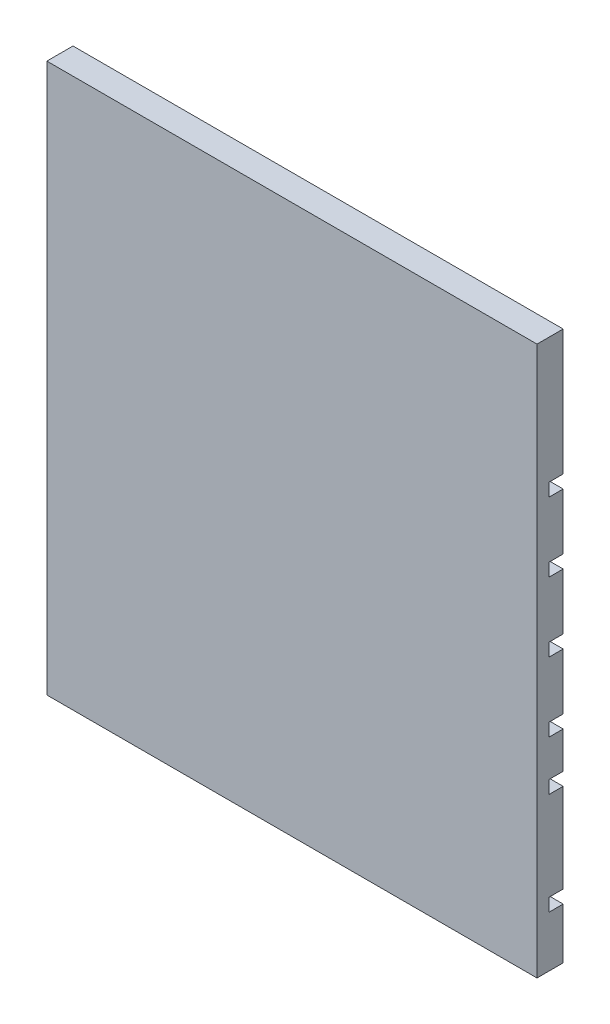
ISO-10303-21;
HEADER;
FILE_DESCRIPTION(('STEP AP214'),'2;1');
FILE_NAME('part.step','',(''),(''),'','','');
FILE_SCHEMA(('AUTOMOTIVE_DESIGN { 1 0 10303 214 1 1 1 1 }'));
ENDSEC;
DATA;
#1=APPLICATION_CONTEXT('core data for automotive mechanical design processes');
#2=APPLICATION_PROTOCOL_DEFINITION('international standard','automotive_design',2000,#1);
#3=PRODUCT_CONTEXT('',#1,'mechanical');
#4=PRODUCT('Part','Part','',(#3));
#5=PRODUCT_RELATED_PRODUCT_CATEGORY('part','',(#4));
#6=PRODUCT_DEFINITION_FORMATION('','',#4);
#7=PRODUCT_DEFINITION_CONTEXT('part definition',#1,'design');
#8=PRODUCT_DEFINITION('design','',#6,#7);
#9=PRODUCT_DEFINITION_SHAPE('','',#8);
#10=(LENGTH_UNIT() NAMED_UNIT(*) SI_UNIT(.MILLI.,.METRE.));
#11=(NAMED_UNIT(*) PLANE_ANGLE_UNIT() SI_UNIT($,.RADIAN.));
#12=(NAMED_UNIT(*) SI_UNIT($,.STERADIAN.) SOLID_ANGLE_UNIT());
#13=UNCERTAINTY_MEASURE_WITH_UNIT(LENGTH_MEASURE(1.E-05),#10,'distance_accuracy_value','');
#14=(GEOMETRIC_REPRESENTATION_CONTEXT(3) GLOBAL_UNCERTAINTY_ASSIGNED_CONTEXT((#13)) GLOBAL_UNIT_ASSIGNED_CONTEXT((#10,
#11,#12)) REPRESENTATION_CONTEXT('',''));
#15=CARTESIAN_POINT('',(0.,0.,0.));
#16=DIRECTION('',(0.,0.,1.));
#17=DIRECTION('',(1.,0.,0.));
#18=AXIS2_PLACEMENT_3D('',#15,#16,#17);
#19=CARTESIAN_POINT('',(-75.,-8.,2.));
#20=DIRECTION('',(1.,0.,0.));
#21=DIRECTION('',(0.,0.,-1.));
#22=AXIS2_PLACEMENT_3D('',#19,#20,#21);
#23=PLANE('',#22);
#24=DIRECTION('',(0.,0.,-1.));
#25=VECTOR('',#24,1.);
#26=CARTESIAN_POINT('',(-75.,24.987500000001,2.));
#27=LINE('',#26,#25);
#28=CARTESIAN_POINT('',(-75.,24.987500000001,0.199999999999214));
#29=VERTEX_POINT('',#28);
#30=CARTESIAN_POINT('',(-75.,24.987500000001,-2.));
#31=VERTEX_POINT('',#30);
#32=EDGE_CURVE('E237',#29,#31,#27,.T.);
#33=ORIENTED_EDGE('',*,*,#32,.F.);
#34=DIRECTION('',(0.,1.,0.));
#35=VECTOR('',#34,1.);
#36=CARTESIAN_POINT('',(-75.,-8.,0.199999999999214));
#37=LINE('',#36,#35);
#38=CARTESIAN_POINT('',(-75.,23.000000000001,0.199999999999214));
#39=VERTEX_POINT('',#38);
#40=EDGE_CURVE('E230',#39,#29,#37,.T.);
#41=ORIENTED_EDGE('',*,*,#40,.F.);
#42=DIRECTION('',(0.,0.,-1.));
#43=VECTOR('',#42,1.);
#44=CARTESIAN_POINT('',(-75.,23.000000000001,2.));
#45=LINE('',#44,#43);
#46=CARTESIAN_POINT('',(-75.,23.000000000001,-2.));
#47=VERTEX_POINT('',#46);
#48=EDGE_CURVE('E217',#39,#47,#45,.T.);
#49=ORIENTED_EDGE('',*,*,#48,.T.);
#50=DIRECTION('',(0.,-1.,0.));
#51=VECTOR('',#50,1.);
#52=CARTESIAN_POINT('',(-75.,-8.,-2.));
#53=LINE('',#52,#51);
#54=CARTESIAN_POINT('',(-75.,17.387500000001,-2.));
#55=VERTEX_POINT('',#54);
#56=EDGE_CURVE('E348',#47,#55,#53,.T.);
#57=ORIENTED_EDGE('',*,*,#56,.T.);
#58=DIRECTION('',(0.,0.,1.));
#59=VECTOR('',#58,1.);
#60=CARTESIAN_POINT('',(-75.,17.387500000001,2.));
#61=LINE('',#60,#59);
#62=CARTESIAN_POINT('',(-75.,17.387500000001,0.199999999999214));
#63=VERTEX_POINT('',#62);
#64=EDGE_CURVE('E308',#55,#63,#61,.T.);
#65=ORIENTED_EDGE('',*,*,#64,.T.);
#66=DIRECTION('',(0.,1.,0.));
#67=VECTOR('',#66,1.);
#68=CARTESIAN_POINT('',(-75.,-8.,0.199999999999214));
#69=LINE('',#68,#67);
#70=CARTESIAN_POINT('',(-75.,15.400000000001,0.199999999999214));
#71=VERTEX_POINT('',#70);
#72=EDGE_CURVE('E311',#71,#63,#69,.T.);
#73=ORIENTED_EDGE('',*,*,#72,.F.);
#74=DIRECTION('',(0.,0.,1.));
#75=VECTOR('',#74,1.);
#76=CARTESIAN_POINT('',(-75.,15.400000000001,2.));
#77=LINE('',#76,#75);
#78=CARTESIAN_POINT('',(-75.,15.400000000001,-2.));
#79=VERTEX_POINT('',#78);
#80=EDGE_CURVE('E303',#79,#71,#77,.T.);
#81=ORIENTED_EDGE('',*,*,#80,.F.);
#82=CARTESIAN_POINT('',(-75.,1.78750000000105,-2.));
#83=VERTEX_POINT('',#82);
#84=EDGE_CURVE('E413',#79,#83,#53,.T.);
#85=ORIENTED_EDGE('',*,*,#84,.T.);
#86=DIRECTION('',(0.,0.,-1.));
#87=VECTOR('',#86,1.);
#88=CARTESIAN_POINT('',(-75.,1.78750000000105,2.));
#89=LINE('',#88,#87);
#90=CARTESIAN_POINT('',(-75.,1.78750000000105,0.199999999999221));
#91=VERTEX_POINT('',#90);
#92=EDGE_CURVE('E290',#91,#83,#89,.T.);
#93=ORIENTED_EDGE('',*,*,#92,.F.);
#94=DIRECTION('',(0.,1.,0.));
#95=VECTOR('',#94,1.);
#96=CARTESIAN_POINT('',(-75.,-8.,0.199999999999221));
#97=LINE('',#96,#95);
#98=CARTESIAN_POINT('',(-75.,-0.199999999998953,0.199999999999221));
#99=VERTEX_POINT('',#98);
#100=EDGE_CURVE('E292',#99,#91,#97,.T.);
#101=ORIENTED_EDGE('',*,*,#100,.F.);
#102=DIRECTION('',(0.,0.,-1.));
#103=VECTOR('',#102,1.);
#104=CARTESIAN_POINT('',(-75.,-0.199999999998953,2.));
#105=LINE('',#104,#103);
#106=CARTESIAN_POINT('',(-75.,-0.199999999998953,-2.));
#107=VERTEX_POINT('',#106);
#108=EDGE_CURVE('E284',#99,#107,#105,.T.);
#109=ORIENTED_EDGE('',*,*,#108,.T.);
#110=CARTESIAN_POINT('',(-75.,-8.,-2.));
#111=VERTEX_POINT('',#110);
#112=EDGE_CURVE('E331',#107,#111,#53,.T.);
#113=ORIENTED_EDGE('',*,*,#112,.T.);
#114=DIRECTION('',(0.,0.,-1.));
#115=VECTOR('',#114,1.);
#116=CARTESIAN_POINT('',(-75.,-8.,2.));
#117=LINE('',#116,#115);
#118=CARTESIAN_POINT('',(-75.,-8.,2.));
#119=VERTEX_POINT('',#118);
#120=EDGE_CURVE('E364',#119,#111,#117,.T.);
#121=ORIENTED_EDGE('',*,*,#120,.F.);
#122=DIRECTION('',(0.,-1.,0.));
#123=VECTOR('',#122,1.);
#124=CARTESIAN_POINT('',(-75.,-8.,2.));
#125=LINE('',#124,#123);
#126=CARTESIAN_POINT('',(-75.,76.,2.));
#127=VERTEX_POINT('',#126);
#128=EDGE_CURVE('E332',#127,#119,#125,.T.);
#129=ORIENTED_EDGE('',*,*,#128,.F.);
#130=DIRECTION('',(0.,0.,-1.));
#131=VECTOR('',#130,1.);
#132=CARTESIAN_POINT('',(-75.,76.,2.));
#133=LINE('',#132,#131);
#134=CARTESIAN_POINT('',(-75.,76.,-2.));
#135=VERTEX_POINT('',#134);
#136=EDGE_CURVE('E342',#127,#135,#133,.T.);
#137=ORIENTED_EDGE('',*,*,#136,.T.);
#138=CARTESIAN_POINT('',(-75.,56.787500000001,-2.));
#139=VERTEX_POINT('',#138);
#140=EDGE_CURVE('E343',#135,#139,#53,.T.);
#141=ORIENTED_EDGE('',*,*,#140,.T.);
#142=DIRECTION('',(0.,0.,-1.));
#143=VECTOR('',#142,1.);
#144=CARTESIAN_POINT('',(-75.,56.7875000000011,2.));
#145=LINE('',#144,#143);
#146=CARTESIAN_POINT('',(-75.,56.787500000001,0.199999999999214));
#147=VERTEX_POINT('',#146);
#148=EDGE_CURVE('E327',#147,#139,#145,.T.);
#149=ORIENTED_EDGE('',*,*,#148,.F.);
#150=DIRECTION('',(0.,1.,0.));
#151=VECTOR('',#150,1.);
#152=CARTESIAN_POINT('',(-75.,-8.,0.199999999999214));
#153=LINE('',#152,#151);
#154=CARTESIAN_POINT('',(-75.,54.800000000001,0.199999999999214));
#155=VERTEX_POINT('',#154);
#156=EDGE_CURVE('E329',#155,#147,#153,.T.);
#157=ORIENTED_EDGE('',*,*,#156,.F.);
#158=DIRECTION('',(0.,0.,-1.));
#159=VECTOR('',#158,1.);
#160=CARTESIAN_POINT('',(-75.,54.800000000001,2.));
#161=LINE('',#160,#159);
#162=CARTESIAN_POINT('',(-75.,54.800000000001,-2.));
#163=VERTEX_POINT('',#162);
#164=EDGE_CURVE('E322',#155,#163,#161,.T.);
#165=ORIENTED_EDGE('',*,*,#164,.T.);
#166=CARTESIAN_POINT('',(-75.,46.187500000001,-2.));
#167=VERTEX_POINT('',#166);
#168=EDGE_CURVE('E347',#163,#167,#53,.T.);
#169=ORIENTED_EDGE('',*,*,#168,.T.);
#170=DIRECTION('',(0.,0.,-1.));
#171=VECTOR('',#170,1.);
#172=CARTESIAN_POINT('',(-75.,46.187500000001,2.));
#173=LINE('',#172,#171);
#174=CARTESIAN_POINT('',(-75.,46.187500000001,0.199999999999214));
#175=VERTEX_POINT('',#174);
#176=EDGE_CURVE('E273',#175,#167,#173,.T.);
#177=ORIENTED_EDGE('',*,*,#176,.F.);
#178=DIRECTION('',(0.,1.,0.));
#179=VECTOR('',#178,1.);
#180=CARTESIAN_POINT('',(-75.,-8.,0.199999999999214));
#181=LINE('',#180,#179);
#182=CARTESIAN_POINT('',(-75.,44.2000000000011,0.199999999999214));
#183=VERTEX_POINT('',#182);
#184=EDGE_CURVE('E275',#183,#175,#181,.T.);
#185=ORIENTED_EDGE('',*,*,#184,.F.);
#186=DIRECTION('',(0.,0.,-1.));
#187=VECTOR('',#186,1.);
#188=CARTESIAN_POINT('',(-75.,44.2000000000011,2.));
#189=LINE('',#188,#187);
#190=CARTESIAN_POINT('',(-75.,44.2000000000011,-2.));
#191=VERTEX_POINT('',#190);
#192=EDGE_CURVE('E268',#183,#191,#189,.T.);
#193=ORIENTED_EDGE('',*,*,#192,.T.);
#194=CARTESIAN_POINT('',(-75.,35.587500000001,-2.));
#195=VERTEX_POINT('',#194);
#196=EDGE_CURVE('E411',#191,#195,#53,.T.);
#197=ORIENTED_EDGE('',*,*,#196,.T.);
#198=DIRECTION('',(0.,0.,-1.));
#199=VECTOR('',#198,1.);
#200=CARTESIAN_POINT('',(-75.,35.587500000001,2.));
#201=LINE('',#200,#199);
#202=CARTESIAN_POINT('',(-75.,35.587500000001,0.199999999999214));
#203=VERTEX_POINT('',#202);
#204=EDGE_CURVE('E255',#203,#195,#201,.T.);
#205=ORIENTED_EDGE('',*,*,#204,.F.);
#206=DIRECTION('',(0.,1.,0.));
#207=VECTOR('',#206,1.);
#208=CARTESIAN_POINT('',(-75.,-8.,0.199999999999214));
#209=LINE('',#208,#207);
#210=CARTESIAN_POINT('',(-75.,33.600000000001,0.199999999999214));
#211=VERTEX_POINT('',#210);
#212=EDGE_CURVE('E257',#211,#203,#209,.T.);
#213=ORIENTED_EDGE('',*,*,#212,.F.);
#214=DIRECTION('',(0.,0.,-1.));
#215=VECTOR('',#214,1.);
#216=CARTESIAN_POINT('',(-75.,33.600000000001,2.));
#217=LINE('',#216,#215);
#218=CARTESIAN_POINT('',(-75.,33.600000000001,-2.));
#219=VERTEX_POINT('',#218);
#220=EDGE_CURVE('E250',#211,#219,#217,.T.);
#221=ORIENTED_EDGE('',*,*,#220,.T.);
#222=EDGE_CURVE('E408',#219,#31,#53,.T.);
#223=ORIENTED_EDGE('',*,*,#222,.T.);
#224=EDGE_LOOP('',(#33,#41,#49,#57,#65,#73,#81,#85,#93,#101,#109,#113,#121,#129,#137,#141,#149,
#157,#165,#169,#177,#185,#193,#197,#205,#213,#221,#223));
#225=FACE_BOUND('',#224,.T.);
#226=ADVANCED_FACE('F33',(#225),#23,.F.);
#227=CARTESIAN_POINT('',(0.,-8.,2.));
#228=DIRECTION('',(-1.,0.,0.));
#229=DIRECTION('',(0.,0.,1.));
#230=AXIS2_PLACEMENT_3D('',#227,#228,#229);
#231=PLANE('',#230);
#232=DIRECTION('',(0.,0.,1.));
#233=VECTOR('',#232,1.);
#234=CARTESIAN_POINT('',(0.,24.9875,2.));
#235=LINE('',#234,#233);
#236=CARTESIAN_POINT('',(0.,24.9875,-2.));
#237=VERTEX_POINT('',#236);
#238=CARTESIAN_POINT('',(0.,24.9875,0.2));
#239=VERTEX_POINT('',#238);
#240=EDGE_CURVE('E225',#237,#239,#235,.T.);
#241=ORIENTED_EDGE('',*,*,#240,.F.);
#242=DIRECTION('',(0.,1.,0.));
#243=VECTOR('',#242,1.);
#244=CARTESIAN_POINT('',(0.,-8.,-2.));
#245=LINE('',#244,#243);
#246=CARTESIAN_POINT('',(0.,33.6000000000005,-2.));
#247=VERTEX_POINT('',#246);
#248=EDGE_CURVE('E55',#237,#247,#245,.T.);
#249=ORIENTED_EDGE('',*,*,#248,.T.);
#250=DIRECTION('',(0.,0.,1.));
#251=VECTOR('',#250,1.);
#252=CARTESIAN_POINT('',(0.,33.6,2.));
#253=LINE('',#252,#251);
#254=CARTESIAN_POINT('',(0.,33.6,0.2));
#255=VERTEX_POINT('',#254);
#256=EDGE_CURVE('E247',#247,#255,#253,.T.);
#257=ORIENTED_EDGE('',*,*,#256,.T.);
#258=DIRECTION('',(0.,-1.,0.));
#259=VECTOR('',#258,1.);
#260=CARTESIAN_POINT('',(0.,-8.,0.2));
#261=LINE('',#260,#259);
#262=CARTESIAN_POINT('',(0.,35.5875,0.2));
#263=VERTEX_POINT('',#262);
#264=EDGE_CURVE('E401',#263,#255,#261,.T.);
#265=ORIENTED_EDGE('',*,*,#264,.F.);
#266=DIRECTION('',(0.,0.,1.));
#267=VECTOR('',#266,1.);
#268=CARTESIAN_POINT('',(0.,35.5875,2.));
#269=LINE('',#268,#267);
#270=CARTESIAN_POINT('',(0.,35.5875,-2.));
#271=VERTEX_POINT('',#270);
#272=EDGE_CURVE('E253',#271,#263,#269,.T.);
#273=ORIENTED_EDGE('',*,*,#272,.F.);
#274=CARTESIAN_POINT('',(0.,44.2000000000005,-2.));
#275=VERTEX_POINT('',#274);
#276=EDGE_CURVE('E448',#271,#275,#245,.T.);
#277=ORIENTED_EDGE('',*,*,#276,.T.);
#278=DIRECTION('',(0.,0.,1.));
#279=VECTOR('',#278,1.);
#280=CARTESIAN_POINT('',(0.,44.2,2.));
#281=LINE('',#280,#279);
#282=CARTESIAN_POINT('',(0.,44.2,0.2));
#283=VERTEX_POINT('',#282);
#284=EDGE_CURVE('E263',#275,#283,#281,.T.);
#285=ORIENTED_EDGE('',*,*,#284,.T.);
#286=DIRECTION('',(0.,-1.,0.));
#287=VECTOR('',#286,1.);
#288=CARTESIAN_POINT('',(0.,-8.,0.2));
#289=LINE('',#288,#287);
#290=CARTESIAN_POINT('',(0.,46.1875,0.2));
#291=VERTEX_POINT('',#290);
#292=EDGE_CURVE('E394',#291,#283,#289,.T.);
#293=ORIENTED_EDGE('',*,*,#292,.F.);
#294=DIRECTION('',(0.,0.,1.));
#295=VECTOR('',#294,1.);
#296=CARTESIAN_POINT('',(0.,46.1875,2.));
#297=LINE('',#296,#295);
#298=CARTESIAN_POINT('',(0.,46.1875,-2.));
#299=VERTEX_POINT('',#298);
#300=EDGE_CURVE('E271',#299,#291,#297,.T.);
#301=ORIENTED_EDGE('',*,*,#300,.F.);
#302=CARTESIAN_POINT('',(0.,54.8000000000005,-2.));
#303=VERTEX_POINT('',#302);
#304=EDGE_CURVE('E428',#299,#303,#245,.T.);
#305=ORIENTED_EDGE('',*,*,#304,.T.);
#306=DIRECTION('',(0.,0.,1.));
#307=VECTOR('',#306,1.);
#308=CARTESIAN_POINT('',(0.,54.8,2.));
#309=LINE('',#308,#307);
#310=CARTESIAN_POINT('',(0.,54.8,0.2));
#311=VERTEX_POINT('',#310);
#312=EDGE_CURVE('E317',#303,#311,#309,.T.);
#313=ORIENTED_EDGE('',*,*,#312,.T.);
#314=DIRECTION('',(0.,-1.,0.));
#315=VECTOR('',#314,1.);
#316=CARTESIAN_POINT('',(0.,-8.,0.2));
#317=LINE('',#316,#315);
#318=CARTESIAN_POINT('',(0.,56.7875,0.2));
#319=VERTEX_POINT('',#318);
#320=EDGE_CURVE('E372',#319,#311,#317,.T.);
#321=ORIENTED_EDGE('',*,*,#320,.F.);
#322=DIRECTION('',(0.,0.,1.));
#323=VECTOR('',#322,1.);
#324=CARTESIAN_POINT('',(0.,56.7875,2.));
#325=LINE('',#324,#323);
#326=CARTESIAN_POINT('',(0.,56.7875,-2.));
#327=VERTEX_POINT('',#326);
#328=EDGE_CURVE('E325',#327,#319,#325,.T.);
#329=ORIENTED_EDGE('',*,*,#328,.F.);
#330=CARTESIAN_POINT('',(0.,76.,-2.));
#331=VERTEX_POINT('',#330);
#332=EDGE_CURVE('E350',#327,#331,#245,.T.);
#333=ORIENTED_EDGE('',*,*,#332,.T.);
#334=DIRECTION('',(0.,0.,-1.));
#335=VECTOR('',#334,1.);
#336=CARTESIAN_POINT('',(0.,76.,2.));
#337=LINE('',#336,#335);
#338=CARTESIAN_POINT('',(0.,76.,2.));
#339=VERTEX_POINT('',#338);
#340=EDGE_CURVE('E358',#339,#331,#337,.T.);
#341=ORIENTED_EDGE('',*,*,#340,.F.);
#342=DIRECTION('',(0.,1.,0.));
#343=VECTOR('',#342,1.);
#344=CARTESIAN_POINT('',(0.,-8.,2.));
#345=LINE('',#344,#343);
#346=CARTESIAN_POINT('',(0.,-8.,2.));
#347=VERTEX_POINT('',#346);
#348=EDGE_CURVE('E338',#347,#339,#345,.T.);
#349=ORIENTED_EDGE('',*,*,#348,.F.);
#350=DIRECTION('',(0.,0.,-1.));
#351=VECTOR('',#350,1.);
#352=CARTESIAN_POINT('',(0.,-8.,2.));
#353=LINE('',#352,#351);
#354=CARTESIAN_POINT('',(0.,-8.,-2.));
#355=VERTEX_POINT('',#354);
#356=EDGE_CURVE('E361',#347,#355,#353,.T.);
#357=ORIENTED_EDGE('',*,*,#356,.T.);
#358=CARTESIAN_POINT('',(0.,-0.2,-2.));
#359=VERTEX_POINT('',#358);
#360=EDGE_CURVE('E351',#355,#359,#245,.T.);
#361=ORIENTED_EDGE('',*,*,#360,.T.);
#362=DIRECTION('',(0.,0.,1.));
#363=VECTOR('',#362,1.);
#364=CARTESIAN_POINT('',(0.,-0.2,2.));
#365=LINE('',#364,#363);
#366=CARTESIAN_POINT('',(0.,-0.2,0.200000000000002));
#367=VERTEX_POINT('',#366);
#368=EDGE_CURVE('E381',#359,#367,#365,.T.);
#369=ORIENTED_EDGE('',*,*,#368,.T.);
#370=DIRECTION('',(0.,-1.,0.));
#371=VECTOR('',#370,1.);
#372=CARTESIAN_POINT('',(0.,-8.,0.2));
#373=LINE('',#372,#371);
#374=CARTESIAN_POINT('',(0.,1.7875,0.2));
#375=VERTEX_POINT('',#374);
#376=EDGE_CURVE('E384',#375,#367,#373,.T.);
#377=ORIENTED_EDGE('',*,*,#376,.F.);
#378=DIRECTION('',(0.,0.,1.));
#379=VECTOR('',#378,1.);
#380=CARTESIAN_POINT('',(0.,1.7875,2.));
#381=LINE('',#380,#379);
#382=CARTESIAN_POINT('',(0.,1.7875,-2.));
#383=VERTEX_POINT('',#382);
#384=EDGE_CURVE('E387',#383,#375,#381,.T.);
#385=ORIENTED_EDGE('',*,*,#384,.F.);
#386=CARTESIAN_POINT('',(0.,15.4000000000005,-2.));
#387=VERTEX_POINT('',#386);
#388=EDGE_CURVE('E354',#383,#387,#245,.T.);
#389=ORIENTED_EDGE('',*,*,#388,.T.);
#390=DIRECTION('',(0.,0.,-1.));
#391=VECTOR('',#390,1.);
#392=CARTESIAN_POINT('',(0.,15.4,2.));
#393=LINE('',#392,#391);
#394=CARTESIAN_POINT('',(0.,15.4,0.2));
#395=VERTEX_POINT('',#394);
#396=EDGE_CURVE('E300',#395,#387,#393,.T.);
#397=ORIENTED_EDGE('',*,*,#396,.F.);
#398=DIRECTION('',(0.,-1.,0.));
#399=VECTOR('',#398,1.);
#400=CARTESIAN_POINT('',(0.,-8.,0.2));
#401=LINE('',#400,#399);
#402=CARTESIAN_POINT('',(0.,17.3875,0.2));
#403=VERTEX_POINT('',#402);
#404=EDGE_CURVE('E379',#403,#395,#401,.T.);
#405=ORIENTED_EDGE('',*,*,#404,.F.);
#406=DIRECTION('',(0.,0.,-1.));
#407=VECTOR('',#406,1.);
#408=CARTESIAN_POINT('',(0.,17.3875,2.));
#409=LINE('',#408,#407);
#410=CARTESIAN_POINT('',(0.,17.3875,-2.));
#411=VERTEX_POINT('',#410);
#412=EDGE_CURVE('E305',#403,#411,#409,.T.);
#413=ORIENTED_EDGE('',*,*,#412,.T.);
#414=CARTESIAN_POINT('',(0.,23.0000000000005,-2.));
#415=VERTEX_POINT('',#414);
#416=EDGE_CURVE('E518',#411,#415,#245,.T.);
#417=ORIENTED_EDGE('',*,*,#416,.T.);
#418=DIRECTION('',(0.,0.,1.));
#419=VECTOR('',#418,1.);
#420=CARTESIAN_POINT('',(0.,23.,2.));
#421=LINE('',#420,#419);
#422=CARTESIAN_POINT('',(0.,23.,0.2));
#423=VERTEX_POINT('',#422);
#424=EDGE_CURVE('E47',#415,#423,#421,.T.);
#425=ORIENTED_EDGE('',*,*,#424,.T.);
#426=DIRECTION('',(0.,-1.,0.));
#427=VECTOR('',#426,1.);
#428=CARTESIAN_POINT('',(0.,-8.,0.2));
#429=LINE('',#428,#427);
#430=EDGE_CURVE('E11',#239,#423,#429,.T.);
#431=ORIENTED_EDGE('',*,*,#430,.F.);
#432=EDGE_LOOP('',(#241,#249,#257,#265,#273,#277,#285,#293,#301,#305,#313,#321,#329,#333,#341,
#349,#357,#361,#369,#377,#385,#389,#397,#405,#413,#417,#425,#431));
#433=FACE_BOUND('',#432,.T.);
#434=ADVANCED_FACE('F434',(#433),#231,.F.);
#435=CARTESIAN_POINT('',(0.,0.,-2.));
#436=DIRECTION('',(0.,0.,-1.));
#437=DIRECTION('',(-1.,0.,0.));
#438=AXIS2_PLACEMENT_3D('',#435,#436,#437);
#439=PLANE('',#438);
#440=ORIENTED_EDGE('',*,*,#248,.F.);
#441=DIRECTION('',(-1.,0.,0.));
#442=VECTOR('',#441,1.);
#443=CARTESIAN_POINT('',(3.48973761942883E-13,24.9875,-2.));
#444=LINE('',#443,#442);
#445=EDGE_CURVE('E40',#237,#31,#444,.T.);
#446=ORIENTED_EDGE('',*,*,#445,.T.);
#447=ORIENTED_EDGE('',*,*,#222,.F.);
#448=DIRECTION('',(-1.,0.,0.));
#449=VECTOR('',#448,1.);
#450=CARTESIAN_POINT('',(4.69255363733101E-13,33.6,-2.));
#451=LINE('',#450,#449);
#452=EDGE_CURVE('E396',#247,#219,#451,.T.);
#453=ORIENTED_EDGE('',*,*,#452,.F.);
#454=EDGE_LOOP('',(#440,#446,#447,#453));
#455=FACE_BOUND('',#454,.T.);
#456=ADVANCED_FACE('F406',(#455),#439,.T.);
#457=ORIENTED_EDGE('',*,*,#276,.F.);
#458=DIRECTION('',(-1.,0.,0.));
#459=VECTOR('',#458,1.);
#460=CARTESIAN_POINT('',(4.9701265645392E-13,35.5875,-2.));
#461=LINE('',#460,#459);
#462=EDGE_CURVE('E398',#271,#195,#461,.T.);
#463=ORIENTED_EDGE('',*,*,#462,.T.);
#464=ORIENTED_EDGE('',*,*,#196,.F.);
#465=DIRECTION('',(-1.,0.,0.));
#466=VECTOR('',#465,1.);
#467=CARTESIAN_POINT('',(6.17294258244139E-13,44.2,-2.));
#468=LINE('',#467,#466);
#469=EDGE_CURVE('E389',#275,#191,#468,.T.);
#470=ORIENTED_EDGE('',*,*,#469,.F.);
#471=EDGE_LOOP('',(#457,#463,#464,#470));
#472=FACE_BOUND('',#471,.T.);
#473=ADVANCED_FACE('F447',(#472),#439,.T.);
#474=ORIENTED_EDGE('',*,*,#304,.F.);
#475=DIRECTION('',(-1.,0.,0.));
#476=VECTOR('',#475,1.);
#477=CARTESIAN_POINT('',(6.45051550964958E-13,46.1875,-2.));
#478=LINE('',#477,#476);
#479=EDGE_CURVE('E391',#299,#167,#478,.T.);
#480=ORIENTED_EDGE('',*,*,#479,.T.);
#481=ORIENTED_EDGE('',*,*,#168,.F.);
#482=DIRECTION('',(-1.,0.,0.));
#483=VECTOR('',#482,1.);
#484=CARTESIAN_POINT('',(7.65333152755177E-13,54.8,-2.));
#485=LINE('',#484,#483);
#486=EDGE_CURVE('E367',#303,#163,#485,.T.);
#487=ORIENTED_EDGE('',*,*,#486,.F.);
#488=EDGE_LOOP('',(#474,#480,#481,#487));
#489=FACE_BOUND('',#488,.T.);
#490=ADVANCED_FACE('F427',(#489),#439,.T.);
#491=ORIENTED_EDGE('',*,*,#388,.F.);
#492=DIRECTION('',(-1.,0.,0.));
#493=VECTOR('',#492,1.);
#494=CARTESIAN_POINT('',(0.,1.7875,-2.));
#495=LINE('',#494,#493);
#496=EDGE_CURVE('E287',#383,#83,#495,.T.);
#497=ORIENTED_EDGE('',*,*,#496,.T.);
#498=ORIENTED_EDGE('',*,*,#84,.F.);
#499=DIRECTION('',(1.,0.,0.));
#500=VECTOR('',#499,1.);
#501=CARTESIAN_POINT('',(2.15075375044338E-13,15.4,-2.));
#502=LINE('',#501,#500);
#503=EDGE_CURVE('E374',#79,#387,#502,.T.);
#504=ORIENTED_EDGE('',*,*,#503,.T.);
#505=EDGE_LOOP('',(#491,#497,#498,#504));
#506=FACE_BOUND('',#505,.T.);
#507=ADVANCED_FACE('F517',(#506),#439,.T.);
#508=DIRECTION('',(-1.,0.,0.));
#509=VECTOR('',#508,1.);
#510=CARTESIAN_POINT('',(0.,-0.2,-2.));
#511=LINE('',#510,#509);
#512=EDGE_CURVE('E282',#359,#107,#511,.T.);
#513=ORIENTED_EDGE('',*,*,#512,.F.);
#514=ORIENTED_EDGE('',*,*,#360,.F.);
#515=DIRECTION('',(1.,0.,0.));
#516=VECTOR('',#515,1.);
#517=CARTESIAN_POINT('',(-75.,-8.,-2.));
#518=LINE('',#517,#516);
#519=EDGE_CURVE('E346',#111,#355,#518,.T.);
#520=ORIENTED_EDGE('',*,*,#519,.F.);
#521=ORIENTED_EDGE('',*,*,#112,.F.);
#522=EDGE_LOOP('',(#513,#514,#520,#521));
#523=FACE_BOUND('',#522,.T.);
#524=ADVANCED_FACE('F492',(#523),#439,.T.);
#525=ORIENTED_EDGE('',*,*,#332,.F.);
#526=DIRECTION('',(-1.,0.,0.));
#527=VECTOR('',#526,1.);
#528=CARTESIAN_POINT('',(7.93090445475996E-13,56.7875,-2.));
#529=LINE('',#528,#527);
#530=EDGE_CURVE('E369',#327,#139,#529,.T.);
#531=ORIENTED_EDGE('',*,*,#530,.T.);
#532=ORIENTED_EDGE('',*,*,#140,.F.);
#533=DIRECTION('',(-1.,0.,0.));
#534=VECTOR('',#533,1.);
#535=CARTESIAN_POINT('',(-75.,76.,-2.));
#536=LINE('',#535,#534);
#537=EDGE_CURVE('E336',#331,#135,#536,.T.);
#538=ORIENTED_EDGE('',*,*,#537,.F.);
#539=EDGE_LOOP('',(#525,#531,#532,#538));
#540=FACE_BOUND('',#539,.T.);
#541=ADVANCED_FACE('F484',(#540),#439,.T.);
#542=CARTESIAN_POINT('',(-75.,-8.,2.));
#543=DIRECTION('',(0.,1.,0.));
#544=DIRECTION('',(0.,0.,1.));
#545=AXIS2_PLACEMENT_3D('',#542,#543,#544);
#546=PLANE('',#545);
#547=ORIENTED_EDGE('',*,*,#519,.T.);
#548=ORIENTED_EDGE('',*,*,#356,.F.);
#549=DIRECTION('',(1.,0.,0.));
#550=VECTOR('',#549,1.);
#551=CARTESIAN_POINT('',(-75.,-8.,2.));
#552=LINE('',#551,#550);
#553=EDGE_CURVE('E335',#119,#347,#552,.T.);
#554=ORIENTED_EDGE('',*,*,#553,.F.);
#555=ORIENTED_EDGE('',*,*,#120,.T.);
#556=EDGE_LOOP('',(#547,#548,#554,#555));
#557=FACE_BOUND('',#556,.T.);
#558=ADVANCED_FACE('F482',(#557),#546,.F.);
#559=CARTESIAN_POINT('',(-75.,76.,2.));
#560=DIRECTION('',(0.,-1.,0.));
#561=DIRECTION('',(0.,0.,-1.));
#562=AXIS2_PLACEMENT_3D('',#559,#560,#561);
#563=PLANE('',#562);
#564=ORIENTED_EDGE('',*,*,#537,.T.);
#565=ORIENTED_EDGE('',*,*,#136,.F.);
#566=DIRECTION('',(-1.,0.,0.));
#567=VECTOR('',#566,1.);
#568=CARTESIAN_POINT('',(-75.,76.,2.));
#569=LINE('',#568,#567);
#570=EDGE_CURVE('E340',#339,#127,#569,.T.);
#571=ORIENTED_EDGE('',*,*,#570,.F.);
#572=ORIENTED_EDGE('',*,*,#340,.T.);
#573=EDGE_LOOP('',(#564,#565,#571,#572));
#574=FACE_BOUND('',#573,.T.);
#575=ADVANCED_FACE('F481',(#574),#563,.F.);
#576=CARTESIAN_POINT('',(0.,0.,2.));
#577=DIRECTION('',(0.,0.,-1.));
#578=DIRECTION('',(-1.,0.,0.));
#579=AXIS2_PLACEMENT_3D('',#576,#577,#578);
#580=PLANE('',#579);
#581=ORIENTED_EDGE('',*,*,#128,.T.);
#582=ORIENTED_EDGE('',*,*,#553,.T.);
#583=ORIENTED_EDGE('',*,*,#348,.T.);
#584=ORIENTED_EDGE('',*,*,#570,.T.);
#585=EDGE_LOOP('',(#581,#582,#583,#584));
#586=FACE_BOUND('',#585,.T.);
#587=ADVANCED_FACE('F490',(#586),#580,.F.);
#588=DIRECTION('',(-1.,0.,0.));
#589=VECTOR('',#588,1.);
#590=CARTESIAN_POINT('',(3.21216469222063E-13,23.,-2.));
#591=LINE('',#590,#589);
#592=EDGE_CURVE('E221',#415,#47,#591,.T.);
#593=ORIENTED_EDGE('',*,*,#592,.F.);
#594=ORIENTED_EDGE('',*,*,#416,.F.);
#595=DIRECTION('',(1.,0.,0.));
#596=VECTOR('',#595,1.);
#597=CARTESIAN_POINT('',(2.42832667765157E-13,17.3875,-2.));
#598=LINE('',#597,#596);
#599=EDGE_CURVE('E377',#55,#411,#598,.T.);
#600=ORIENTED_EDGE('',*,*,#599,.F.);
#601=ORIENTED_EDGE('',*,*,#56,.F.);
#602=EDGE_LOOP('',(#593,#594,#600,#601));
#603=FACE_BOUND('',#602,.T.);
#604=ADVANCED_FACE('F479',(#603),#439,.T.);
#605=CARTESIAN_POINT('',(7.88202368770443E-13,56.5875,0.2));
#606=DIRECTION('',(0.,0.,-1.));
#607=DIRECTION('',(-1.,0.,0.));
#608=AXIS2_PLACEMENT_3D('',#605,#606,#607);
#609=PLANE('',#608);
#610=ORIENTED_EDGE('',*,*,#156,.T.);
#611=DIRECTION('',(1.,0.,0.));
#612=VECTOR('',#611,1.);
#613=CARTESIAN_POINT('',(-74.9999999999992,56.787500000001,0.199999999999214));
#614=LINE('',#613,#612);
#615=EDGE_CURVE('E314',#147,#319,#614,.T.);
#616=ORIENTED_EDGE('',*,*,#615,.T.);
#617=ORIENTED_EDGE('',*,*,#320,.T.);
#618=DIRECTION('',(1.,0.,0.));
#619=VECTOR('',#618,1.);
#620=CARTESIAN_POINT('',(-74.9999999999992,54.800000000001,0.199999999999214));
#621=LINE('',#620,#619);
#622=EDGE_CURVE('E313',#155,#311,#621,.T.);
#623=ORIENTED_EDGE('',*,*,#622,.F.);
#624=EDGE_LOOP('',(#610,#616,#617,#623));
#625=FACE_BOUND('',#624,.T.);
#626=ADVANCED_FACE('F535',(#625),#609,.T.);
#627=CARTESIAN_POINT('',(-74.9999999999992,56.787500000001,-7.85583756249611E-13));
#628=DIRECTION('',(0.,-1.,0.));
#629=DIRECTION('',(-1.,0.,0.));
#630=AXIS2_PLACEMENT_3D('',#627,#628,#629);
#631=PLANE('',#630);
#632=ORIENTED_EDGE('',*,*,#148,.T.);
#633=ORIENTED_EDGE('',*,*,#530,.F.);
#634=ORIENTED_EDGE('',*,*,#328,.T.);
#635=ORIENTED_EDGE('',*,*,#615,.F.);
#636=EDGE_LOOP('',(#632,#633,#634,#635));
#637=FACE_BOUND('',#636,.T.);
#638=ADVANCED_FACE('F542',(#637),#631,.T.);
#639=CARTESIAN_POINT('',(-74.9999999999992,54.800000000001,-7.85583756249611E-13));
#640=DIRECTION('',(0.,-1.,0.));
#641=DIRECTION('',(-1.,0.,0.));
#642=AXIS2_PLACEMENT_3D('',#639,#640,#641);
#643=PLANE('',#642);
#644=ORIENTED_EDGE('',*,*,#622,.T.);
#645=ORIENTED_EDGE('',*,*,#312,.F.);
#646=ORIENTED_EDGE('',*,*,#486,.T.);
#647=ORIENTED_EDGE('',*,*,#164,.F.);
#648=EDGE_LOOP('',(#644,#645,#646,#647));
#649=FACE_BOUND('',#648,.T.);
#650=ADVANCED_FACE('F538',(#649),#643,.F.);
#651=CARTESIAN_POINT('',(-74.9999999999997,17.187500000001,0.199999999999214));
#652=DIRECTION('',(0.,0.,-1.));
#653=DIRECTION('',(-1.,0.,0.));
#654=AXIS2_PLACEMENT_3D('',#651,#652,#653);
#655=PLANE('',#654);
#656=ORIENTED_EDGE('',*,*,#72,.T.);
#657=DIRECTION('',(1.,0.,0.));
#658=VECTOR('',#657,1.);
#659=CARTESIAN_POINT('',(-74.9999999999997,17.387500000001,0.199999999999214));
#660=LINE('',#659,#658);
#661=EDGE_CURVE('E297',#63,#403,#660,.T.);
#662=ORIENTED_EDGE('',*,*,#661,.T.);
#663=ORIENTED_EDGE('',*,*,#404,.T.);
#664=DIRECTION('',(1.,0.,0.));
#665=VECTOR('',#664,1.);
#666=CARTESIAN_POINT('',(-74.9999999999998,15.400000000001,0.199999999999214));
#667=LINE('',#666,#665);
#668=EDGE_CURVE('E294',#71,#395,#667,.T.);
#669=ORIENTED_EDGE('',*,*,#668,.F.);
#670=EDGE_LOOP('',(#656,#662,#663,#669));
#671=FACE_BOUND('',#670,.T.);
#672=ADVANCED_FACE('F541',(#671),#655,.T.);
#673=CARTESIAN_POINT('',(17.5000000000002,17.3874999999998,1.83302876458243E-13));
#674=DIRECTION('',(0.,1.,0.));
#675=DIRECTION('',(1.,0.,0.));
#676=AXIS2_PLACEMENT_3D('',#673,#674,#675);
#677=PLANE('',#676);
#678=ORIENTED_EDGE('',*,*,#599,.T.);
#679=ORIENTED_EDGE('',*,*,#412,.F.);
#680=ORIENTED_EDGE('',*,*,#661,.F.);
#681=ORIENTED_EDGE('',*,*,#64,.F.);
#682=EDGE_LOOP('',(#678,#679,#680,#681));
#683=FACE_BOUND('',#682,.T.);
#684=ADVANCED_FACE('F553',(#683),#677,.F.);
#685=CARTESIAN_POINT('',(17.5000000000002,15.3999999999998,1.83302876458243E-13));
#686=DIRECTION('',(0.,1.,0.));
#687=DIRECTION('',(1.,0.,0.));
#688=AXIS2_PLACEMENT_3D('',#685,#686,#687);
#689=PLANE('',#688);
#690=ORIENTED_EDGE('',*,*,#80,.T.);
#691=ORIENTED_EDGE('',*,*,#668,.T.);
#692=ORIENTED_EDGE('',*,*,#396,.T.);
#693=ORIENTED_EDGE('',*,*,#503,.F.);
#694=EDGE_LOOP('',(#690,#691,#692,#693));
#695=FACE_BOUND('',#694,.T.);
#696=ADVANCED_FACE('F550',(#695),#689,.T.);
#697=CARTESIAN_POINT('',(-75.,1.58750000000105,0.199999999999221));
#698=DIRECTION('',(0.,0.,-1.));
#699=DIRECTION('',(-1.,0.,0.));
#700=AXIS2_PLACEMENT_3D('',#697,#698,#699);
#701=PLANE('',#700);
#702=ORIENTED_EDGE('',*,*,#100,.T.);
#703=DIRECTION('',(1.,0.,0.));
#704=VECTOR('',#703,1.);
#705=CARTESIAN_POINT('',(-34.,1.78750000000047,0.199999999999647));
#706=LINE('',#705,#704);
#707=EDGE_CURVE('E279',#91,#375,#706,.T.);
#708=ORIENTED_EDGE('',*,*,#707,.T.);
#709=ORIENTED_EDGE('',*,*,#376,.T.);
#710=DIRECTION('',(1.,0.,0.));
#711=VECTOR('',#710,1.);
#712=CARTESIAN_POINT('',(-34.,-0.199999999999525,0.199999999999647));
#713=LINE('',#712,#711);
#714=EDGE_CURVE('E277',#99,#367,#713,.T.);
#715=ORIENTED_EDGE('',*,*,#714,.F.);
#716=EDGE_LOOP('',(#702,#708,#709,#715));
#717=FACE_BOUND('',#716,.T.);
#718=ADVANCED_FACE('F509',(#717),#701,.T.);
#719=CARTESIAN_POINT('',(-34.,1.78750000000047,-3.00000000000036));
#720=DIRECTION('',(0.,-1.,0.));
#721=DIRECTION('',(-1.,0.,0.));
#722=AXIS2_PLACEMENT_3D('',#719,#720,#721);
#723=PLANE('',#722);
#724=ORIENTED_EDGE('',*,*,#92,.T.);
#725=ORIENTED_EDGE('',*,*,#496,.F.);
#726=ORIENTED_EDGE('',*,*,#384,.T.);
#727=ORIENTED_EDGE('',*,*,#707,.F.);
#728=EDGE_LOOP('',(#724,#725,#726,#727));
#729=FACE_BOUND('',#728,.T.);
#730=ADVANCED_FACE('F512',(#729),#723,.T.);
#731=CARTESIAN_POINT('',(-34.,-0.199999999999525,-3.00000000000036));
#732=DIRECTION('',(0.,-1.,0.));
#733=DIRECTION('',(-1.,0.,0.));
#734=AXIS2_PLACEMENT_3D('',#731,#732,#733);
#735=PLANE('',#734);
#736=ORIENTED_EDGE('',*,*,#714,.T.);
#737=ORIENTED_EDGE('',*,*,#368,.F.);
#738=ORIENTED_EDGE('',*,*,#512,.T.);
#739=ORIENTED_EDGE('',*,*,#108,.F.);
#740=EDGE_LOOP('',(#736,#737,#738,#739));
#741=FACE_BOUND('',#740,.T.);
#742=ADVANCED_FACE('F504',(#741),#735,.F.);
#743=CARTESIAN_POINT('',(6.40163474259405E-13,45.9875,0.2));
#744=DIRECTION('',(0.,0.,-1.));
#745=DIRECTION('',(-1.,0.,0.));
#746=AXIS2_PLACEMENT_3D('',#743,#744,#745);
#747=PLANE('',#746);
#748=ORIENTED_EDGE('',*,*,#184,.T.);
#749=DIRECTION('',(1.,0.,0.));
#750=VECTOR('',#749,1.);
#751=CARTESIAN_POINT('',(-74.9999999999993,46.187500000001,0.199999999999214));
#752=LINE('',#751,#750);
#753=EDGE_CURVE('E260',#175,#291,#752,.T.);
#754=ORIENTED_EDGE('',*,*,#753,.T.);
#755=ORIENTED_EDGE('',*,*,#292,.T.);
#756=DIRECTION('',(1.,0.,0.));
#757=VECTOR('',#756,1.);
#758=CARTESIAN_POINT('',(-74.9999999999994,44.2000000000011,0.199999999999214));
#759=LINE('',#758,#757);
#760=EDGE_CURVE('E259',#183,#283,#759,.T.);
#761=ORIENTED_EDGE('',*,*,#760,.F.);
#762=EDGE_LOOP('',(#748,#754,#755,#761));
#763=FACE_BOUND('',#762,.T.);
#764=ADVANCED_FACE('F439',(#763),#747,.T.);
#765=CARTESIAN_POINT('',(-74.9999999999993,46.187500000001,-7.85583756249611E-13));
#766=DIRECTION('',(0.,-1.,0.));
#767=DIRECTION('',(-1.,0.,0.));
#768=AXIS2_PLACEMENT_3D('',#765,#766,#767);
#769=PLANE('',#768);
#770=ORIENTED_EDGE('',*,*,#176,.T.);
#771=ORIENTED_EDGE('',*,*,#479,.F.);
#772=ORIENTED_EDGE('',*,*,#300,.T.);
#773=ORIENTED_EDGE('',*,*,#753,.F.);
#774=EDGE_LOOP('',(#770,#771,#772,#773));
#775=FACE_BOUND('',#774,.T.);
#776=ADVANCED_FACE('F431',(#775),#769,.T.);
#777=CARTESIAN_POINT('',(-74.9999999999994,44.2000000000011,-7.85583756249611E-13));
#778=DIRECTION('',(0.,-1.,0.));
#779=DIRECTION('',(-1.,0.,0.));
#780=AXIS2_PLACEMENT_3D('',#777,#778,#779);
#781=PLANE('',#780);
#782=ORIENTED_EDGE('',*,*,#760,.T.);
#783=ORIENTED_EDGE('',*,*,#284,.F.);
#784=ORIENTED_EDGE('',*,*,#469,.T.);
#785=ORIENTED_EDGE('',*,*,#192,.F.);
#786=EDGE_LOOP('',(#782,#783,#784,#785));
#787=FACE_BOUND('',#786,.T.);
#788=ADVANCED_FACE('F441',(#787),#781,.F.);
#789=CARTESIAN_POINT('',(4.92124579748367E-13,35.3875,0.2));
#790=DIRECTION('',(0.,0.,-1.));
#791=DIRECTION('',(-1.,0.,0.));
#792=AXIS2_PLACEMENT_3D('',#789,#790,#791);
#793=PLANE('',#792);
#794=ORIENTED_EDGE('',*,*,#212,.T.);
#795=DIRECTION('',(1.,0.,0.));
#796=VECTOR('',#795,1.);
#797=CARTESIAN_POINT('',(-74.9999999999995,35.587500000001,0.199999999999214));
#798=LINE('',#797,#796);
#799=EDGE_CURVE('E241',#203,#263,#798,.T.);
#800=ORIENTED_EDGE('',*,*,#799,.T.);
#801=ORIENTED_EDGE('',*,*,#264,.T.);
#802=DIRECTION('',(1.,0.,0.));
#803=VECTOR('',#802,1.);
#804=CARTESIAN_POINT('',(-74.9999999999995,33.600000000001,0.199999999999214));
#805=LINE('',#804,#803);
#806=EDGE_CURVE('E238',#211,#255,#805,.T.);
#807=ORIENTED_EDGE('',*,*,#806,.F.);
#808=EDGE_LOOP('',(#794,#800,#801,#807));
#809=FACE_BOUND('',#808,.T.);
#810=ADVANCED_FACE('F456',(#809),#793,.T.);
#811=CARTESIAN_POINT('',(-74.9999999999995,35.587500000001,-7.85583756249611E-13));
#812=DIRECTION('',(0.,-1.,0.));
#813=DIRECTION('',(-1.,0.,0.));
#814=AXIS2_PLACEMENT_3D('',#811,#812,#813);
#815=PLANE('',#814);
#816=ORIENTED_EDGE('',*,*,#204,.T.);
#817=ORIENTED_EDGE('',*,*,#462,.F.);
#818=ORIENTED_EDGE('',*,*,#272,.T.);
#819=ORIENTED_EDGE('',*,*,#799,.F.);
#820=EDGE_LOOP('',(#816,#817,#818,#819));
#821=FACE_BOUND('',#820,.T.);
#822=ADVANCED_FACE('F451',(#821),#815,.T.);
#823=CARTESIAN_POINT('',(-74.9999999999995,33.600000000001,-7.85583756249611E-13));
#824=DIRECTION('',(0.,-1.,0.));
#825=DIRECTION('',(-1.,0.,0.));
#826=AXIS2_PLACEMENT_3D('',#823,#824,#825);
#827=PLANE('',#826);
#828=ORIENTED_EDGE('',*,*,#806,.T.);
#829=ORIENTED_EDGE('',*,*,#256,.F.);
#830=ORIENTED_EDGE('',*,*,#452,.T.);
#831=ORIENTED_EDGE('',*,*,#220,.F.);
#832=EDGE_LOOP('',(#828,#829,#830,#831));
#833=FACE_BOUND('',#832,.T.);
#834=ADVANCED_FACE('F458',(#833),#827,.F.);
#835=CARTESIAN_POINT('',(3.4408568523733E-13,24.7875,0.2));
#836=DIRECTION('',(0.,0.,-1.));
#837=DIRECTION('',(-1.,0.,0.));
#838=AXIS2_PLACEMENT_3D('',#835,#836,#837);
#839=PLANE('',#838);
#840=ORIENTED_EDGE('',*,*,#40,.T.);
#841=DIRECTION('',(1.,0.,0.));
#842=VECTOR('',#841,1.);
#843=CARTESIAN_POINT('',(-74.9999999999996,24.987500000001,0.199999999999214));
#844=LINE('',#843,#842);
#845=EDGE_CURVE('E233',#29,#239,#844,.T.);
#846=ORIENTED_EDGE('',*,*,#845,.T.);
#847=ORIENTED_EDGE('',*,*,#430,.T.);
#848=DIRECTION('',(1.,0.,0.));
#849=VECTOR('',#848,1.);
#850=CARTESIAN_POINT('',(-74.9999999999997,23.000000000001,0.199999999999214));
#851=LINE('',#850,#849);
#852=EDGE_CURVE('E220',#39,#423,#851,.T.);
#853=ORIENTED_EDGE('',*,*,#852,.F.);
#854=EDGE_LOOP('',(#840,#846,#847,#853));
#855=FACE_BOUND('',#854,.T.);
#856=ADVANCED_FACE('F228',(#855),#839,.T.);
#857=CARTESIAN_POINT('',(-74.9999999999996,24.987500000001,-7.85583756249611E-13));
#858=DIRECTION('',(0.,-1.,0.));
#859=DIRECTION('',(-1.,0.,0.));
#860=AXIS2_PLACEMENT_3D('',#857,#858,#859);
#861=PLANE('',#860);
#862=ORIENTED_EDGE('',*,*,#32,.T.);
#863=ORIENTED_EDGE('',*,*,#445,.F.);
#864=ORIENTED_EDGE('',*,*,#240,.T.);
#865=ORIENTED_EDGE('',*,*,#845,.F.);
#866=EDGE_LOOP('',(#862,#863,#864,#865));
#867=FACE_BOUND('',#866,.T.);
#868=ADVANCED_FACE('F465',(#867),#861,.T.);
#869=CARTESIAN_POINT('',(-74.9999999999997,23.000000000001,-7.85583756249611E-13));
#870=DIRECTION('',(0.,-1.,0.));
#871=DIRECTION('',(-1.,0.,0.));
#872=AXIS2_PLACEMENT_3D('',#869,#870,#871);
#873=PLANE('',#872);
#874=ORIENTED_EDGE('',*,*,#852,.T.);
#875=ORIENTED_EDGE('',*,*,#424,.F.);
#876=ORIENTED_EDGE('',*,*,#592,.T.);
#877=ORIENTED_EDGE('',*,*,#48,.F.);
#878=EDGE_LOOP('',(#874,#875,#876,#877));
#879=FACE_BOUND('',#878,.T.);
#880=ADVANCED_FACE('F219',(#879),#873,.F.);
#881=CLOSED_SHELL('',(#226,#434,#456,#473,#490,#507,#524,#541,#558,#575,#587,#604,#626,#638,
#650,#672,#684,#696,#718,#730,#742,#764,#776,#788,#810,#822,#834,#856,#868,#880));
#882=MANIFOLD_SOLID_BREP('B2',#881);
#883=ADVANCED_BREP_SHAPE_REPRESENTATION('',(#18,#882),#14);
#884=SHAPE_DEFINITION_REPRESENTATION(#9,#883);
ENDSEC;
END-ISO-10303-21;
